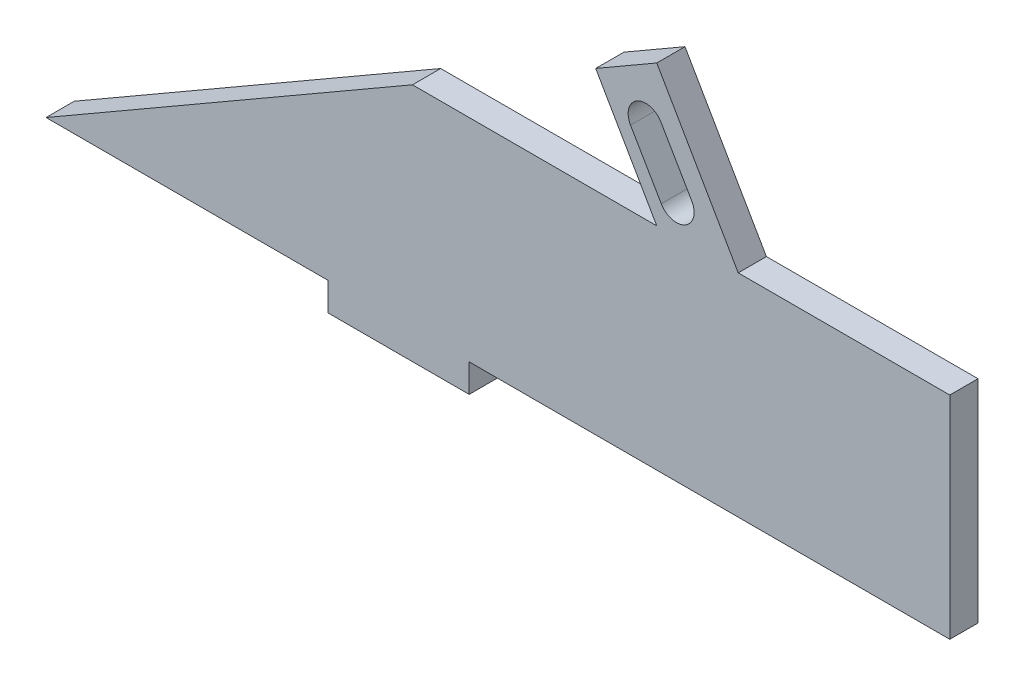
ISO-10303-21;
HEADER;
FILE_DESCRIPTION(('STEP AP214'),'2;1');
FILE_NAME('part.step','',(''),(''),'','','');
FILE_SCHEMA(('AUTOMOTIVE_DESIGN { 1 0 10303 214 1 1 1 1 }'));
ENDSEC;
DATA;
#1=APPLICATION_CONTEXT('core data for automotive mechanical design processes');
#2=APPLICATION_PROTOCOL_DEFINITION('international standard','automotive_design',2000,#1);
#3=PRODUCT_CONTEXT('',#1,'mechanical');
#4=PRODUCT('Part','Part','',(#3));
#5=PRODUCT_RELATED_PRODUCT_CATEGORY('part','',(#4));
#6=PRODUCT_DEFINITION_FORMATION('','',#4);
#7=PRODUCT_DEFINITION_CONTEXT('part definition',#1,'design');
#8=PRODUCT_DEFINITION('design','',#6,#7);
#9=PRODUCT_DEFINITION_SHAPE('','',#8);
#10=(LENGTH_UNIT() NAMED_UNIT(*) SI_UNIT(.MILLI.,.METRE.));
#11=(NAMED_UNIT(*) PLANE_ANGLE_UNIT() SI_UNIT($,.RADIAN.));
#12=(NAMED_UNIT(*) SI_UNIT($,.STERADIAN.) SOLID_ANGLE_UNIT());
#13=UNCERTAINTY_MEASURE_WITH_UNIT(LENGTH_MEASURE(1.E-05),#10,'distance_accuracy_value','');
#14=(GEOMETRIC_REPRESENTATION_CONTEXT(3) GLOBAL_UNCERTAINTY_ASSIGNED_CONTEXT((#13)) GLOBAL_UNIT_ASSIGNED_CONTEXT((#10,
#11,#12)) REPRESENTATION_CONTEXT('',''));
#15=CARTESIAN_POINT('',(0.,0.,0.));
#16=DIRECTION('',(0.,0.,1.));
#17=DIRECTION('',(1.,0.,0.));
#18=AXIS2_PLACEMENT_3D('',#15,#16,#17);
#19=CARTESIAN_POINT('',(-11.5470053850001,50.0000000020914,4.));
#20=DIRECTION('',(-0.866025403784436,-0.500000000000004,0.));
#21=DIRECTION('',(0.500000000000004,-0.866025403784436,0.));
#22=AXIS2_PLACEMENT_3D('',#19,#20,#21);
#23=PLANE('',#22);
#24=DIRECTION('',(-0.500000000000004,0.866025403784436,0.));
#25=VECTOR('',#24,1.);
#26=CARTESIAN_POINT('',(-11.5470053850001,50.0000000020914,0.));
#27=LINE('',#26,#25);
#28=CARTESIAN_POINT('',(0.,30.,0.));
#29=VERTEX_POINT('',#28);
#30=CARTESIAN_POINT('',(-11.5470053850001,50.0000000020914,0.));
#31=VERTEX_POINT('',#30);
#32=EDGE_CURVE('E207',#29,#31,#27,.T.);
#33=ORIENTED_EDGE('',*,*,#32,.T.);
#34=DIRECTION('',(0.,0.,-1.));
#35=VECTOR('',#34,1.);
#36=CARTESIAN_POINT('',(-11.5470053850001,50.0000000020914,4.));
#37=LINE('',#36,#35);
#38=CARTESIAN_POINT('',(-11.5470053850001,50.0000000020914,4.));
#39=VERTEX_POINT('',#38);
#40=EDGE_CURVE('E44',#39,#31,#37,.T.);
#41=ORIENTED_EDGE('',*,*,#40,.F.);
#42=DIRECTION('',(-0.500000000000004,0.866025403784436,0.));
#43=VECTOR('',#42,1.);
#44=CARTESIAN_POINT('',(-11.5470053850001,50.0000000020914,4.));
#45=LINE('',#44,#43);
#46=CARTESIAN_POINT('',(0.,30.,4.));
#47=VERTEX_POINT('',#46);
#48=EDGE_CURVE('E213',#47,#39,#45,.T.);
#49=ORIENTED_EDGE('',*,*,#48,.F.);
#50=DIRECTION('',(0.,0.,-1.));
#51=VECTOR('',#50,1.);
#52=CARTESIAN_POINT('',(0.,30.,4.));
#53=LINE('',#52,#51);
#54=EDGE_CURVE('E11',#47,#29,#53,.T.);
#55=ORIENTED_EDGE('',*,*,#54,.T.);
#56=EDGE_LOOP('',(#33,#41,#49,#55));
#57=FACE_BOUND('',#56,.T.);
#58=ADVANCED_FACE('F37',(#57),#23,.F.);
#59=CARTESIAN_POINT('',(-20.2072594228445,45.0000000020913,4.));
#60=DIRECTION('',(0.500000000000003,-0.866025403784437,0.));
#61=DIRECTION('',(0.866025403784437,0.500000000000004,0.));
#62=AXIS2_PLACEMENT_3D('',#59,#60,#61);
#63=PLANE('',#62);
#64=DIRECTION('',(-0.866025403784437,-0.500000000000004,0.));
#65=VECTOR('',#64,1.);
#66=CARTESIAN_POINT('',(-20.2072594228445,45.0000000020913,0.));
#67=LINE('',#66,#65);
#68=CARTESIAN_POINT('',(-20.2072594228445,45.0000000020913,0.));
#69=VERTEX_POINT('',#68);
#70=EDGE_CURVE('E231',#31,#69,#67,.T.);
#71=ORIENTED_EDGE('',*,*,#70,.T.);
#72=DIRECTION('',(0.,0.,-1.));
#73=VECTOR('',#72,1.);
#74=CARTESIAN_POINT('',(-20.2072594228445,45.0000000020913,4.));
#75=LINE('',#74,#73);
#76=CARTESIAN_POINT('',(-20.2072594228445,45.0000000020913,4.));
#77=VERTEX_POINT('',#76);
#78=EDGE_CURVE('E267',#77,#69,#75,.T.);
#79=ORIENTED_EDGE('',*,*,#78,.F.);
#80=DIRECTION('',(-0.866025403784437,-0.500000000000004,0.));
#81=VECTOR('',#80,1.);
#82=CARTESIAN_POINT('',(-20.2072594228445,45.0000000020913,4.));
#83=LINE('',#82,#81);
#84=EDGE_CURVE('E215',#39,#77,#83,.T.);
#85=ORIENTED_EDGE('',*,*,#84,.F.);
#86=ORIENTED_EDGE('',*,*,#40,.T.);
#87=EDGE_LOOP('',(#71,#79,#85,#86));
#88=FACE_BOUND('',#87,.T.);
#89=ADVANCED_FACE('F274',(#88),#63,.F.);
#90=CARTESIAN_POINT('',(-11.5470053837925,30.,4.));
#91=DIRECTION('',(0.866025403784436,0.500000000000004,0.));
#92=DIRECTION('',(-0.500000000000004,0.866025403784436,0.));
#93=AXIS2_PLACEMENT_3D('',#90,#91,#92);
#94=PLANE('',#93);
#95=DIRECTION('',(0.500000000000004,-0.866025403784436,0.));
#96=VECTOR('',#95,1.);
#97=CARTESIAN_POINT('',(-11.5470053837925,30.,0.));
#98=LINE('',#97,#96);
#99=CARTESIAN_POINT('',(-11.5470053837925,30.,0.));
#100=VERTEX_POINT('',#99);
#101=EDGE_CURVE('E233',#69,#100,#98,.T.);
#102=ORIENTED_EDGE('',*,*,#101,.T.);
#103=DIRECTION('',(0.,0.,-1.));
#104=VECTOR('',#103,1.);
#105=CARTESIAN_POINT('',(-11.5470053837925,30.,4.));
#106=LINE('',#105,#104);
#107=CARTESIAN_POINT('',(-11.5470053837925,30.,4.));
#108=VERTEX_POINT('',#107);
#109=EDGE_CURVE('E264',#108,#100,#106,.T.);
#110=ORIENTED_EDGE('',*,*,#109,.F.);
#111=DIRECTION('',(0.500000000000004,-0.866025403784436,0.));
#112=VECTOR('',#111,1.);
#113=CARTESIAN_POINT('',(-11.5470053837925,30.,4.));
#114=LINE('',#113,#112);
#115=EDGE_CURVE('E217',#77,#108,#114,.T.);
#116=ORIENTED_EDGE('',*,*,#115,.F.);
#117=ORIENTED_EDGE('',*,*,#78,.T.);
#118=EDGE_LOOP('',(#102,#110,#116,#117));
#119=FACE_BOUND('',#118,.T.);
#120=ADVANCED_FACE('F285',(#119),#94,.F.);
#121=CARTESIAN_POINT('',(-46.1880215454087,30.,4.));
#122=DIRECTION('',(0.,-1.,0.));
#123=DIRECTION('',(1.,0.,0.));
#124=AXIS2_PLACEMENT_3D('',#121,#122,#123);
#125=PLANE('',#124);
#126=DIRECTION('',(-1.,0.,0.));
#127=VECTOR('',#126,1.);
#128=CARTESIAN_POINT('',(-46.1880215454087,30.,0.));
#129=LINE('',#128,#127);
#130=CARTESIAN_POINT('',(-46.1880215454087,30.,0.));
#131=VERTEX_POINT('',#130);
#132=EDGE_CURVE('E235',#100,#131,#129,.T.);
#133=ORIENTED_EDGE('',*,*,#132,.T.);
#134=DIRECTION('',(0.,0.,-1.));
#135=VECTOR('',#134,1.);
#136=CARTESIAN_POINT('',(-46.1880215454087,30.,4.));
#137=LINE('',#136,#135);
#138=CARTESIAN_POINT('',(-46.1880215454087,30.,4.));
#139=VERTEX_POINT('',#138);
#140=EDGE_CURVE('E261',#139,#131,#137,.T.);
#141=ORIENTED_EDGE('',*,*,#140,.F.);
#142=DIRECTION('',(-1.,0.,0.));
#143=VECTOR('',#142,1.);
#144=CARTESIAN_POINT('',(-46.1880215454087,30.,4.));
#145=LINE('',#144,#143);
#146=EDGE_CURVE('E219',#108,#139,#145,.T.);
#147=ORIENTED_EDGE('',*,*,#146,.F.);
#148=ORIENTED_EDGE('',*,*,#109,.T.);
#149=EDGE_LOOP('',(#133,#141,#147,#148));
#150=FACE_BOUND('',#149,.T.);
#151=ADVANCED_FACE('F289',(#150),#125,.F.);
#152=CARTESIAN_POINT('',(-98.1495457724757,0.,4.));
#153=DIRECTION('',(0.499999999999995,-0.866025403784442,0.));
#154=DIRECTION('',(0.866025403784442,0.499999999999995,0.));
#155=AXIS2_PLACEMENT_3D('',#152,#153,#154);
#156=PLANE('',#155);
#157=DIRECTION('',(-0.866025403784442,-0.499999999999995,0.));
#158=VECTOR('',#157,1.);
#159=CARTESIAN_POINT('',(-98.1495457724757,0.,0.));
#160=LINE('',#159,#158);
#161=CARTESIAN_POINT('',(-98.1495457724757,0.,0.));
#162=VERTEX_POINT('',#161);
#163=EDGE_CURVE('E237',#131,#162,#160,.T.);
#164=ORIENTED_EDGE('',*,*,#163,.T.);
#165=DIRECTION('',(0.,0.,-1.));
#166=VECTOR('',#165,1.);
#167=CARTESIAN_POINT('',(-98.1495457724757,0.,4.));
#168=LINE('',#167,#166);
#169=CARTESIAN_POINT('',(-98.1495457724757,0.,4.));
#170=VERTEX_POINT('',#169);
#171=EDGE_CURVE('E258',#170,#162,#168,.T.);
#172=ORIENTED_EDGE('',*,*,#171,.F.);
#173=DIRECTION('',(-0.866025403784442,-0.499999999999995,0.));
#174=VECTOR('',#173,1.);
#175=CARTESIAN_POINT('',(-98.1495457724757,0.,4.));
#176=LINE('',#175,#174);
#177=EDGE_CURVE('E221',#139,#170,#176,.T.);
#178=ORIENTED_EDGE('',*,*,#177,.F.);
#179=ORIENTED_EDGE('',*,*,#140,.T.);
#180=EDGE_LOOP('',(#164,#172,#178,#179));
#181=FACE_BOUND('',#180,.T.);
#182=ADVANCED_FACE('F315',(#181),#156,.F.);
#183=CARTESIAN_POINT('',(-58.1495457724757,0.,4.));
#184=DIRECTION('',(0.,1.,0.));
#185=DIRECTION('',(-1.,0.,0.));
#186=AXIS2_PLACEMENT_3D('',#183,#184,#185);
#187=PLANE('',#186);
#188=DIRECTION('',(1.,0.,0.));
#189=VECTOR('',#188,1.);
#190=CARTESIAN_POINT('',(-58.1495457724757,0.,0.));
#191=LINE('',#190,#189);
#192=CARTESIAN_POINT('',(-58.1495457724757,0.,0.));
#193=VERTEX_POINT('',#192);
#194=EDGE_CURVE('E239',#162,#193,#191,.T.);
#195=ORIENTED_EDGE('',*,*,#194,.T.);
#196=DIRECTION('',(0.,0.,-1.));
#197=VECTOR('',#196,1.);
#198=CARTESIAN_POINT('',(-58.1495457724757,0.,4.));
#199=LINE('',#198,#197);
#200=CARTESIAN_POINT('',(-58.1495457724757,0.,4.));
#201=VERTEX_POINT('',#200);
#202=EDGE_CURVE('E255',#201,#193,#199,.T.);
#203=ORIENTED_EDGE('',*,*,#202,.F.);
#204=DIRECTION('',(1.,0.,0.));
#205=VECTOR('',#204,1.);
#206=CARTESIAN_POINT('',(-58.1495457724757,0.,4.));
#207=LINE('',#206,#205);
#208=EDGE_CURVE('E223',#170,#201,#207,.T.);
#209=ORIENTED_EDGE('',*,*,#208,.F.);
#210=ORIENTED_EDGE('',*,*,#171,.T.);
#211=EDGE_LOOP('',(#195,#203,#209,#210));
#212=FACE_BOUND('',#211,.T.);
#213=ADVANCED_FACE('F312',(#212),#187,.F.);
#214=CARTESIAN_POINT('',(-58.1495457724757,0.,4.));
#215=DIRECTION('',(1.,0.,0.));
#216=DIRECTION('',(0.,1.,0.));
#217=AXIS2_PLACEMENT_3D('',#214,#215,#216);
#218=PLANE('',#217);
#219=DIRECTION('',(0.,-1.,0.));
#220=VECTOR('',#219,1.);
#221=CARTESIAN_POINT('',(-58.1495457724757,0.,0.));
#222=LINE('',#221,#220);
#223=CARTESIAN_POINT('',(-58.1495457724757,-4.00000000000001,0.));
#224=VERTEX_POINT('',#223);
#225=EDGE_CURVE('E241',#193,#224,#222,.T.);
#226=ORIENTED_EDGE('',*,*,#225,.T.);
#227=DIRECTION('',(0.,0.,-1.));
#228=VECTOR('',#227,1.);
#229=CARTESIAN_POINT('',(-58.1495457724757,-4.00000000000001,4.));
#230=LINE('',#229,#228);
#231=CARTESIAN_POINT('',(-58.1495457724757,-4.00000000000001,4.));
#232=VERTEX_POINT('',#231);
#233=EDGE_CURVE('E252',#232,#224,#230,.T.);
#234=ORIENTED_EDGE('',*,*,#233,.F.);
#235=DIRECTION('',(0.,-1.,0.));
#236=VECTOR('',#235,1.);
#237=CARTESIAN_POINT('',(-58.1495457724757,0.,4.));
#238=LINE('',#237,#236);
#239=EDGE_CURVE('E225',#201,#232,#238,.T.);
#240=ORIENTED_EDGE('',*,*,#239,.F.);
#241=ORIENTED_EDGE('',*,*,#202,.T.);
#242=EDGE_LOOP('',(#226,#234,#240,#241));
#243=FACE_BOUND('',#242,.T.);
#244=ADVANCED_FACE('F308',(#243),#218,.F.);
#245=CARTESIAN_POINT('',(-58.1495457724757,-4.00000000000001,4.));
#246=DIRECTION('',(0.,1.,0.));
#247=DIRECTION('',(-1.,0.,0.));
#248=AXIS2_PLACEMENT_3D('',#245,#246,#247);
#249=PLANE('',#248);
#250=DIRECTION('',(1.,0.,0.));
#251=VECTOR('',#250,1.);
#252=CARTESIAN_POINT('',(-58.1495457724757,-4.00000000000001,0.));
#253=LINE('',#252,#251);
#254=CARTESIAN_POINT('',(-38.1495457724757,-4.00000000000001,0.));
#255=VERTEX_POINT('',#254);
#256=EDGE_CURVE('E243',#224,#255,#253,.T.);
#257=ORIENTED_EDGE('',*,*,#256,.T.);
#258=DIRECTION('',(0.,0.,-1.));
#259=VECTOR('',#258,1.);
#260=CARTESIAN_POINT('',(-38.1495457724757,-4.00000000000001,4.));
#261=LINE('',#260,#259);
#262=CARTESIAN_POINT('',(-38.1495457724757,-4.00000000000001,4.));
#263=VERTEX_POINT('',#262);
#264=EDGE_CURVE('E249',#263,#255,#261,.T.);
#265=ORIENTED_EDGE('',*,*,#264,.F.);
#266=DIRECTION('',(1.,0.,0.));
#267=VECTOR('',#266,1.);
#268=CARTESIAN_POINT('',(-58.1495457724757,-4.00000000000001,4.));
#269=LINE('',#268,#267);
#270=EDGE_CURVE('E227',#232,#263,#269,.T.);
#271=ORIENTED_EDGE('',*,*,#270,.F.);
#272=ORIENTED_EDGE('',*,*,#233,.T.);
#273=EDGE_LOOP('',(#257,#265,#271,#272));
#274=FACE_BOUND('',#273,.T.);
#275=ADVANCED_FACE('F304',(#274),#249,.F.);
#276=CARTESIAN_POINT('',(-38.1495457724757,-4.00000000000001,4.));
#277=DIRECTION('',(-1.,0.,0.));
#278=DIRECTION('',(0.,0.,1.));
#279=AXIS2_PLACEMENT_3D('',#276,#277,#278);
#280=PLANE('',#279);
#281=DIRECTION('',(0.,1.,0.));
#282=VECTOR('',#281,1.);
#283=CARTESIAN_POINT('',(-38.1495457724757,-4.00000000000001,0.));
#284=LINE('',#283,#282);
#285=CARTESIAN_POINT('',(-38.1495457724757,0.,0.));
#286=VERTEX_POINT('',#285);
#287=EDGE_CURVE('E245',#255,#286,#284,.T.);
#288=ORIENTED_EDGE('',*,*,#287,.T.);
#289=DIRECTION('',(0.,0.,-1.));
#290=VECTOR('',#289,1.);
#291=CARTESIAN_POINT('',(-38.1495457724757,0.,4.));
#292=LINE('',#291,#290);
#293=CARTESIAN_POINT('',(-38.1495457724757,0.,4.));
#294=VERTEX_POINT('',#293);
#295=EDGE_CURVE('E160',#294,#286,#292,.T.);
#296=ORIENTED_EDGE('',*,*,#295,.F.);
#297=DIRECTION('',(0.,1.,0.));
#298=VECTOR('',#297,1.);
#299=CARTESIAN_POINT('',(-38.1495457724757,-4.00000000000001,4.));
#300=LINE('',#299,#298);
#301=EDGE_CURVE('E156',#263,#294,#300,.T.);
#302=ORIENTED_EDGE('',*,*,#301,.F.);
#303=ORIENTED_EDGE('',*,*,#264,.T.);
#304=EDGE_LOOP('',(#288,#296,#302,#303));
#305=FACE_BOUND('',#304,.T.);
#306=ADVANCED_FACE('F300',(#305),#280,.F.);
#307=CARTESIAN_POINT('',(0.,0.,4.));
#308=DIRECTION('',(0.,1.,0.));
#309=DIRECTION('',(-1.,0.,0.));
#310=AXIS2_PLACEMENT_3D('',#307,#308,#309);
#311=PLANE('',#310);
#312=DIRECTION('',(1.,0.,0.));
#313=VECTOR('',#312,1.);
#314=CARTESIAN_POINT('',(0.,0.,0.));
#315=LINE('',#314,#313);
#316=CARTESIAN_POINT('',(30.,0.,0.));
#317=VERTEX_POINT('',#316);
#318=EDGE_CURVE('E166',#286,#317,#315,.T.);
#319=ORIENTED_EDGE('',*,*,#318,.T.);
#320=DIRECTION('',(0.,0.,-1.));
#321=VECTOR('',#320,1.);
#322=CARTESIAN_POINT('',(30.,0.,0.));
#323=LINE('',#322,#321);
#324=CARTESIAN_POINT('',(30.,0.,4.));
#325=VERTEX_POINT('',#324);
#326=EDGE_CURVE('E163',#325,#317,#323,.T.);
#327=ORIENTED_EDGE('',*,*,#326,.F.);
#328=DIRECTION('',(1.,0.,0.));
#329=VECTOR('',#328,1.);
#330=CARTESIAN_POINT('',(0.,0.,4.));
#331=LINE('',#330,#329);
#332=EDGE_CURVE('E149',#294,#325,#331,.T.);
#333=ORIENTED_EDGE('',*,*,#332,.F.);
#334=ORIENTED_EDGE('',*,*,#295,.T.);
#335=EDGE_LOOP('',(#319,#327,#333,#334));
#336=FACE_BOUND('',#335,.T.);
#337=ADVANCED_FACE('F164',(#336),#311,.F.);
#338=CARTESIAN_POINT('',(0.,0.,4.));
#339=DIRECTION('',(0.,0.,-1.));
#340=DIRECTION('',(-1.,0.,0.));
#341=AXIS2_PLACEMENT_3D('',#338,#339,#340);
#342=PLANE('',#341);
#343=DIRECTION('',(-0.503627072539798,0.863921160641984,0.));
#344=VECTOR('',#343,1.);
#345=CARTESIAN_POINT('',(-6.59347906486119,35.551516575484,4.));
#346=LINE('',#345,#344);
#347=CARTESIAN_POINT('',(-6.59347906486119,35.551516575484,4.));
#348=VERTEX_POINT('',#347);
#349=CARTESIAN_POINT('',(-10.9504408620206,43.0254426170141,4.));
#350=VERTEX_POINT('',#349);
#351=EDGE_CURVE('E197',#348,#350,#346,.T.);
#352=ORIENTED_EDGE('',*,*,#351,.F.);
#353=CARTESIAN_POINT('',(-8.75328196646615,34.2924488941345,4.));
#354=DIRECTION('',(0.,0.,1.));
#355=DIRECTION('',(1.,0.,0.));
#356=AXIS2_PLACEMENT_3D('',#353,#354,#355);
#357=CIRCLE('',#356,2.5);
#358=CARTESIAN_POINT('',(-10.9130848680711,33.033381212785,4.));
#359=VERTEX_POINT('',#358);
#360=EDGE_CURVE('E51',#359,#348,#357,.T.);
#361=ORIENTED_EDGE('',*,*,#360,.F.);
#362=DIRECTION('',(0.503627072539798,-0.863921160641984,0.));
#363=VECTOR('',#362,1.);
#364=CARTESIAN_POINT('',(-10.9130848680711,33.033381212785,4.));
#365=LINE('',#364,#363);
#366=CARTESIAN_POINT('',(-15.2700466652305,40.5073072543151,4.));
#367=VERTEX_POINT('',#366);
#368=EDGE_CURVE('E188',#367,#359,#365,.T.);
#369=ORIENTED_EDGE('',*,*,#368,.F.);
#370=CARTESIAN_POINT('',(-13.1102437636256,41.7663749356646,4.));
#371=DIRECTION('',(0.,0.,1.));
#372=DIRECTION('',(1.,0.,0.));
#373=AXIS2_PLACEMENT_3D('',#370,#371,#372);
#374=CIRCLE('',#373,2.5);
#375=EDGE_CURVE('E200',#350,#367,#374,.T.);
#376=ORIENTED_EDGE('',*,*,#375,.F.);
#377=EDGE_LOOP('',(#352,#361,#369,#376));
#378=FACE_BOUND('',#377,.T.);
#379=ORIENTED_EDGE('',*,*,#332,.T.);
#380=DIRECTION('',(0.,-1.,0.));
#381=VECTOR('',#380,1.);
#382=CARTESIAN_POINT('',(30.,0.,4.));
#383=LINE('',#382,#381);
#384=CARTESIAN_POINT('',(30.,30.,4.));
#385=VERTEX_POINT('',#384);
#386=EDGE_CURVE('E154',#385,#325,#383,.T.);
#387=ORIENTED_EDGE('',*,*,#386,.F.);
#388=DIRECTION('',(-1.,0.,0.));
#389=VECTOR('',#388,1.);
#390=CARTESIAN_POINT('',(30.,30.,4.));
#391=LINE('',#390,#389);
#392=EDGE_CURVE('E179',#385,#47,#391,.T.);
#393=ORIENTED_EDGE('',*,*,#392,.T.);
#394=ORIENTED_EDGE('',*,*,#48,.T.);
#395=ORIENTED_EDGE('',*,*,#84,.T.);
#396=ORIENTED_EDGE('',*,*,#115,.T.);
#397=ORIENTED_EDGE('',*,*,#146,.T.);
#398=ORIENTED_EDGE('',*,*,#177,.T.);
#399=ORIENTED_EDGE('',*,*,#208,.T.);
#400=ORIENTED_EDGE('',*,*,#239,.T.);
#401=ORIENTED_EDGE('',*,*,#270,.T.);
#402=ORIENTED_EDGE('',*,*,#301,.T.);
#403=EDGE_LOOP('',(#379,#387,#393,#394,#395,#396,#397,#398,#399,#400,#401,#402));
#404=FACE_BOUND('',#403,.T.);
#405=ADVANCED_FACE('F151',(#378,#404),#342,.F.);
#406=CARTESIAN_POINT('',(0.,0.,0.));
#407=DIRECTION('',(0.,0.,-1.));
#408=DIRECTION('',(-1.,0.,0.));
#409=AXIS2_PLACEMENT_3D('',#406,#407,#408);
#410=PLANE('',#409);
#411=CARTESIAN_POINT('',(-8.75328196646615,34.2924488941345,0.));
#412=DIRECTION('',(0.,0.,1.));
#413=DIRECTION('',(1.,0.,0.));
#414=AXIS2_PLACEMENT_3D('',#411,#412,#413);
#415=CIRCLE('',#414,2.5);
#416=CARTESIAN_POINT('',(-10.9130848680711,33.033381212785,0.));
#417=VERTEX_POINT('',#416);
#418=CARTESIAN_POINT('',(-6.59347906486119,35.551516575484,0.));
#419=VERTEX_POINT('',#418);
#420=EDGE_CURVE('E184',#417,#419,#415,.T.);
#421=ORIENTED_EDGE('',*,*,#420,.T.);
#422=DIRECTION('',(-0.503627072539798,0.863921160641984,0.));
#423=VECTOR('',#422,1.);
#424=CARTESIAN_POINT('',(-6.59347906486119,35.551516575484,0.));
#425=LINE('',#424,#423);
#426=CARTESIAN_POINT('',(-10.9504408620206,43.0254426170141,0.));
#427=VERTEX_POINT('',#426);
#428=EDGE_CURVE('E187',#419,#427,#425,.T.);
#429=ORIENTED_EDGE('',*,*,#428,.T.);
#430=CARTESIAN_POINT('',(-13.1102437636256,41.7663749356646,0.));
#431=DIRECTION('',(0.,0.,1.));
#432=DIRECTION('',(1.,0.,0.));
#433=AXIS2_PLACEMENT_3D('',#430,#431,#432);
#434=CIRCLE('',#433,2.5);
#435=CARTESIAN_POINT('',(-15.2700466652305,40.5073072543151,0.));
#436=VERTEX_POINT('',#435);
#437=EDGE_CURVE('E59',#427,#436,#434,.T.);
#438=ORIENTED_EDGE('',*,*,#437,.T.);
#439=DIRECTION('',(0.503627072539798,-0.863921160641984,0.));
#440=VECTOR('',#439,1.);
#441=CARTESIAN_POINT('',(-10.9130848680711,33.033381212785,0.));
#442=LINE('',#441,#440);
#443=EDGE_CURVE('E192',#436,#417,#442,.T.);
#444=ORIENTED_EDGE('',*,*,#443,.T.);
#445=EDGE_LOOP('',(#421,#429,#438,#444));
#446=FACE_BOUND('',#445,.T.);
#447=ORIENTED_EDGE('',*,*,#32,.F.);
#448=DIRECTION('',(-1.,0.,0.));
#449=VECTOR('',#448,1.);
#450=CARTESIAN_POINT('',(30.,30.,0.));
#451=LINE('',#450,#449);
#452=CARTESIAN_POINT('',(30.,30.,0.));
#453=VERTEX_POINT('',#452);
#454=EDGE_CURVE('E181',#453,#29,#451,.T.);
#455=ORIENTED_EDGE('',*,*,#454,.F.);
#456=DIRECTION('',(0.,1.,0.));
#457=VECTOR('',#456,1.);
#458=CARTESIAN_POINT('',(30.,30.,0.));
#459=LINE('',#458,#457);
#460=EDGE_CURVE('E169',#317,#453,#459,.T.);
#461=ORIENTED_EDGE('',*,*,#460,.F.);
#462=ORIENTED_EDGE('',*,*,#318,.F.);
#463=ORIENTED_EDGE('',*,*,#287,.F.);
#464=ORIENTED_EDGE('',*,*,#256,.F.);
#465=ORIENTED_EDGE('',*,*,#225,.F.);
#466=ORIENTED_EDGE('',*,*,#194,.F.);
#467=ORIENTED_EDGE('',*,*,#163,.F.);
#468=ORIENTED_EDGE('',*,*,#132,.F.);
#469=ORIENTED_EDGE('',*,*,#101,.F.);
#470=ORIENTED_EDGE('',*,*,#70,.F.);
#471=EDGE_LOOP('',(#447,#455,#461,#462,#463,#464,#465,#466,#467,#468,#469,#470));
#472=FACE_BOUND('',#471,.T.);
#473=ADVANCED_FACE('F279',(#446,#472),#410,.T.);
#474=CARTESIAN_POINT('',(-8.75328196646615,34.2924488941345,0.));
#475=DIRECTION('',(0.,0.,1.));
#476=DIRECTION('',(1.,0.,0.));
#477=AXIS2_PLACEMENT_3D('',#474,#475,#476);
#478=CYLINDRICAL_SURFACE('',#477,2.5);
#479=ORIENTED_EDGE('',*,*,#360,.T.);
#480=DIRECTION('',(0.,0.,1.));
#481=VECTOR('',#480,1.);
#482=CARTESIAN_POINT('',(-6.59347906486119,35.551516575484,0.));
#483=LINE('',#482,#481);
#484=EDGE_CURVE('E195',#419,#348,#483,.T.);
#485=ORIENTED_EDGE('',*,*,#484,.F.);
#486=ORIENTED_EDGE('',*,*,#420,.F.);
#487=DIRECTION('',(0.,0.,1.));
#488=VECTOR('',#487,1.);
#489=CARTESIAN_POINT('',(-10.9130848680711,33.033381212785,0.));
#490=LINE('',#489,#488);
#491=EDGE_CURVE('E205',#417,#359,#490,.T.);
#492=ORIENTED_EDGE('',*,*,#491,.T.);
#493=EDGE_LOOP('',(#479,#485,#486,#492));
#494=FACE_BOUND('',#493,.T.);
#495=ADVANCED_FACE('F379',(#494),#478,.F.);
#496=CARTESIAN_POINT('',(-10.9130848680711,33.033381212785,0.));
#497=DIRECTION('',(-0.863921160641984,-0.503627072539798,0.));
#498=DIRECTION('',(0.503627072539798,-0.863921160641984,0.));
#499=AXIS2_PLACEMENT_3D('',#496,#497,#498);
#500=PLANE('',#499);
#501=ORIENTED_EDGE('',*,*,#368,.T.);
#502=ORIENTED_EDGE('',*,*,#491,.F.);
#503=ORIENTED_EDGE('',*,*,#443,.F.);
#504=DIRECTION('',(0.,0.,1.));
#505=VECTOR('',#504,1.);
#506=CARTESIAN_POINT('',(-15.2700466652305,40.5073072543151,0.));
#507=LINE('',#506,#505);
#508=EDGE_CURVE('E208',#436,#367,#507,.T.);
#509=ORIENTED_EDGE('',*,*,#508,.T.);
#510=EDGE_LOOP('',(#501,#502,#503,#509));
#511=FACE_BOUND('',#510,.T.);
#512=ADVANCED_FACE('F384',(#511),#500,.F.);
#513=CARTESIAN_POINT('',(-13.1102437636256,41.7663749356646,0.));
#514=DIRECTION('',(0.,0.,1.));
#515=DIRECTION('',(1.,0.,0.));
#516=AXIS2_PLACEMENT_3D('',#513,#514,#515);
#517=CYLINDRICAL_SURFACE('',#516,2.5);
#518=ORIENTED_EDGE('',*,*,#375,.T.);
#519=ORIENTED_EDGE('',*,*,#508,.F.);
#520=ORIENTED_EDGE('',*,*,#437,.F.);
#521=DIRECTION('',(0.,0.,1.));
#522=VECTOR('',#521,1.);
#523=CARTESIAN_POINT('',(-10.9504408620206,43.0254426170141,0.));
#524=LINE('',#523,#522);
#525=EDGE_CURVE('E210',#427,#350,#524,.T.);
#526=ORIENTED_EDGE('',*,*,#525,.T.);
#527=EDGE_LOOP('',(#518,#519,#520,#526));
#528=FACE_BOUND('',#527,.T.);
#529=ADVANCED_FACE('F395',(#528),#517,.F.);
#530=CARTESIAN_POINT('',(-6.59347906486119,35.551516575484,0.));
#531=DIRECTION('',(0.863921160641984,0.503627072539798,0.));
#532=DIRECTION('',(-0.503627072539798,0.863921160641984,0.));
#533=AXIS2_PLACEMENT_3D('',#530,#531,#532);
#534=PLANE('',#533);
#535=ORIENTED_EDGE('',*,*,#351,.T.);
#536=ORIENTED_EDGE('',*,*,#525,.F.);
#537=ORIENTED_EDGE('',*,*,#428,.F.);
#538=ORIENTED_EDGE('',*,*,#484,.T.);
#539=EDGE_LOOP('',(#535,#536,#537,#538));
#540=FACE_BOUND('',#539,.T.);
#541=ADVANCED_FACE('F405',(#540),#534,.F.);
#542=CARTESIAN_POINT('',(30.,30.,4.));
#543=DIRECTION('',(0.,-1.,0.));
#544=DIRECTION('',(0.,0.,-1.));
#545=AXIS2_PLACEMENT_3D('',#542,#543,#544);
#546=PLANE('',#545);
#547=ORIENTED_EDGE('',*,*,#54,.F.);
#548=ORIENTED_EDGE('',*,*,#392,.F.);
#549=DIRECTION('',(0.,0.,1.));
#550=VECTOR('',#549,1.);
#551=CARTESIAN_POINT('',(30.,30.,4.));
#552=LINE('',#551,#550);
#553=EDGE_CURVE('E173',#453,#385,#552,.T.);
#554=ORIENTED_EDGE('',*,*,#553,.F.);
#555=ORIENTED_EDGE('',*,*,#454,.T.);
#556=EDGE_LOOP('',(#547,#548,#554,#555));
#557=FACE_BOUND('',#556,.T.);
#558=ADVANCED_FACE('F295',(#557),#546,.F.);
#559=CARTESIAN_POINT('',(30.,0.,0.));
#560=DIRECTION('',(-1.,0.,0.));
#561=DIRECTION('',(0.,0.,1.));
#562=AXIS2_PLACEMENT_3D('',#559,#560,#561);
#563=PLANE('',#562);
#564=ORIENTED_EDGE('',*,*,#386,.T.);
#565=ORIENTED_EDGE('',*,*,#326,.T.);
#566=ORIENTED_EDGE('',*,*,#460,.T.);
#567=ORIENTED_EDGE('',*,*,#553,.T.);
#568=EDGE_LOOP('',(#564,#565,#566,#567));
#569=FACE_BOUND('',#568,.T.);
#570=ADVANCED_FACE('F171',(#569),#563,.F.);
#571=CLOSED_SHELL('',(#58,#89,#120,#151,#182,#213,#244,#275,#306,#337,#405,#473,#495,#512,#529,
#541,#558,#570));
#572=MANIFOLD_SOLID_BREP('B2',#571);
#573=ADVANCED_BREP_SHAPE_REPRESENTATION('',(#18,#572),#14);
#574=SHAPE_DEFINITION_REPRESENTATION(#9,#573);
ENDSEC;
END-ISO-10303-21;
